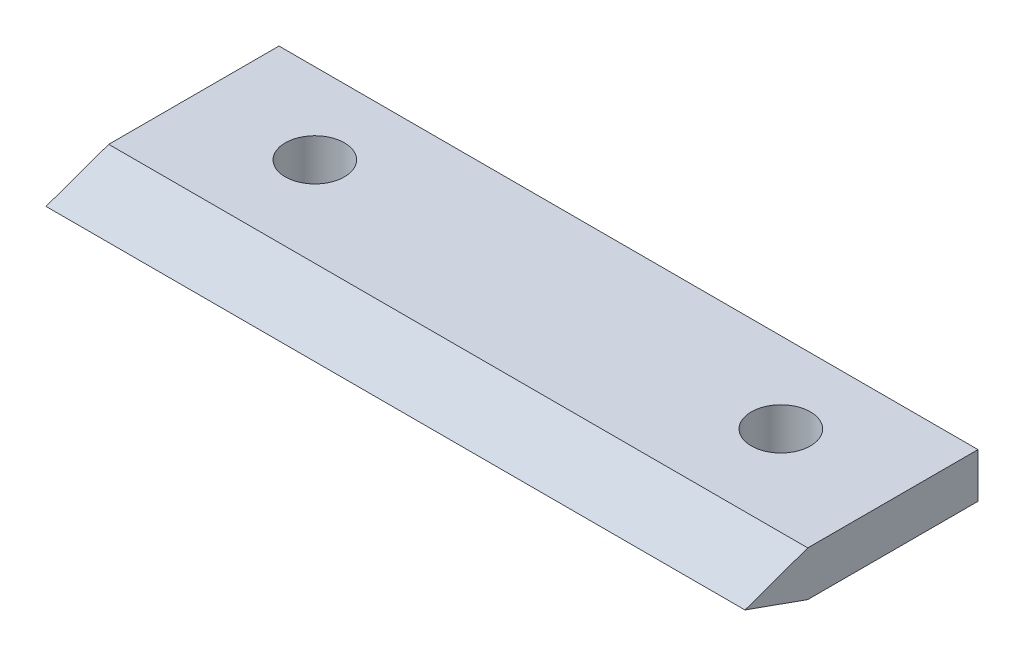
ISO-10303-21;
HEADER;
FILE_DESCRIPTION(('STEP AP214'),'2;1');
FILE_NAME('part.step','',(''),(''),'','','');
FILE_SCHEMA(('AUTOMOTIVE_DESIGN { 1 0 10303 214 1 1 1 1 }'));
ENDSEC;
DATA;
#1=APPLICATION_CONTEXT('core data for automotive mechanical design processes');
#2=APPLICATION_PROTOCOL_DEFINITION('international standard','automotive_design',2000,#1);
#3=PRODUCT_CONTEXT('',#1,'mechanical');
#4=PRODUCT('Part','Part','',(#3));
#5=PRODUCT_RELATED_PRODUCT_CATEGORY('part','',(#4));
#6=PRODUCT_DEFINITION_FORMATION('','',#4);
#7=PRODUCT_DEFINITION_CONTEXT('part definition',#1,'design');
#8=PRODUCT_DEFINITION('design','',#6,#7);
#9=PRODUCT_DEFINITION_SHAPE('','',#8);
#10=(LENGTH_UNIT() NAMED_UNIT(*) SI_UNIT(.MILLI.,.METRE.));
#11=(NAMED_UNIT(*) PLANE_ANGLE_UNIT() SI_UNIT($,.RADIAN.));
#12=(NAMED_UNIT(*) SI_UNIT($,.STERADIAN.) SOLID_ANGLE_UNIT());
#13=UNCERTAINTY_MEASURE_WITH_UNIT(LENGTH_MEASURE(1.E-05),#10,'distance_accuracy_value','');
#14=(GEOMETRIC_REPRESENTATION_CONTEXT(3) GLOBAL_UNCERTAINTY_ASSIGNED_CONTEXT((#13)) GLOBAL_UNIT_ASSIGNED_CONTEXT((#10,
#11,#12)) REPRESENTATION_CONTEXT('',''));
#15=CARTESIAN_POINT('',(0.,0.,0.));
#16=DIRECTION('',(0.,0.,1.));
#17=DIRECTION('',(1.,0.,0.));
#18=AXIS2_PLACEMENT_3D('',#15,#16,#17);
#19=CARTESIAN_POINT('',(0.,2.5,0.));
#20=DIRECTION('',(0.,-1.,0.));
#21=DIRECTION('',(0.,0.,-1.));
#22=AXIS2_PLACEMENT_3D('',#19,#20,#21);
#23=PLANE('',#22);
#24=DIRECTION('',(0.,0.,1.));
#25=VECTOR('',#24,1.);
#26=CARTESIAN_POINT('',(0.,2.5,0.));
#27=LINE('',#26,#25);
#28=CARTESIAN_POINT('',(0.,2.5,-13.));
#29=VERTEX_POINT('',#28);
#30=CARTESIAN_POINT('',(0.,2.5,-3.5));
#31=VERTEX_POINT('',#30);
#32=EDGE_CURVE('E92',#29,#31,#27,.T.);
#33=ORIENTED_EDGE('',*,*,#32,.T.);
#34=DIRECTION('',(1.,0.,0.));
#35=VECTOR('',#34,1.);
#36=CARTESIAN_POINT('',(-3.,2.5,-3.5));
#37=LINE('',#36,#35);
#38=CARTESIAN_POINT('',(39.,2.5,-3.5));
#39=VERTEX_POINT('',#38);
#40=EDGE_CURVE('E139',#31,#39,#37,.T.);
#41=ORIENTED_EDGE('',*,*,#40,.T.);
#42=DIRECTION('',(0.,0.,-1.));
#43=VECTOR('',#42,1.);
#44=CARTESIAN_POINT('',(39.,2.5,0.));
#45=LINE('',#44,#43);
#46=CARTESIAN_POINT('',(39.,2.5,-13.));
#47=VERTEX_POINT('',#46);
#48=EDGE_CURVE('E119',#39,#47,#45,.T.);
#49=ORIENTED_EDGE('',*,*,#48,.T.);
#50=DIRECTION('',(-1.,0.,0.));
#51=VECTOR('',#50,1.);
#52=CARTESIAN_POINT('',(0.,2.5,-13.));
#53=LINE('',#52,#51);
#54=EDGE_CURVE('E71',#47,#29,#53,.T.);
#55=ORIENTED_EDGE('',*,*,#54,.T.);
#56=EDGE_LOOP('',(#33,#41,#49,#55));
#57=FACE_BOUND('',#56,.T.);
#58=CARTESIAN_POINT('',(6.5,2.5,-8.5));
#59=DIRECTION('',(0.,1.,0.));
#60=DIRECTION('',(0.,0.,1.));
#61=AXIS2_PLACEMENT_3D('',#58,#59,#60);
#62=CIRCLE('',#61,1.65);
#63=CARTESIAN_POINT('',(6.5,2.5,-6.85));
#64=VERTEX_POINT('',#63);
#65=EDGE_CURVE('E107',#64,#64,#62,.T.);
#66=ORIENTED_EDGE('',*,*,#65,.F.);
#67=EDGE_LOOP('',(#66));
#68=FACE_BOUND('',#67,.T.);
#69=CARTESIAN_POINT('',(32.5,2.5,-8.5));
#70=DIRECTION('',(0.,1.,0.));
#71=DIRECTION('',(0.,0.,1.));
#72=AXIS2_PLACEMENT_3D('',#69,#70,#71);
#73=CIRCLE('',#72,1.65);
#74=CARTESIAN_POINT('',(32.5,2.5,-6.85));
#75=VERTEX_POINT('',#74);
#76=EDGE_CURVE('E126',#75,#75,#73,.T.);
#77=ORIENTED_EDGE('',*,*,#76,.F.);
#78=EDGE_LOOP('',(#77));
#79=FACE_BOUND('',#78,.T.);
#80=ADVANCED_FACE('F46',(#57,#68,#79),#23,.F.);
#81=CARTESIAN_POINT('',(0.,0.,0.));
#82=DIRECTION('',(0.,-1.,0.));
#83=DIRECTION('',(0.,0.,-1.));
#84=AXIS2_PLACEMENT_3D('',#81,#82,#83);
#85=PLANE('',#84);
#86=DIRECTION('',(1.,0.,0.));
#87=VECTOR('',#86,1.);
#88=CARTESIAN_POINT('',(-3.,0.,-3.5));
#89=LINE('',#88,#87);
#90=CARTESIAN_POINT('',(0.,0.,-3.5));
#91=VERTEX_POINT('',#90);
#92=CARTESIAN_POINT('',(39.,0.,-3.5));
#93=VERTEX_POINT('',#92);
#94=EDGE_CURVE('E105',#91,#93,#89,.T.);
#95=ORIENTED_EDGE('',*,*,#94,.F.);
#96=DIRECTION('',(0.,0.,1.));
#97=VECTOR('',#96,1.);
#98=CARTESIAN_POINT('',(0.,0.,0.));
#99=LINE('',#98,#97);
#100=CARTESIAN_POINT('',(0.,0.,-13.));
#101=VERTEX_POINT('',#100);
#102=EDGE_CURVE('E99',#101,#91,#99,.T.);
#103=ORIENTED_EDGE('',*,*,#102,.F.);
#104=DIRECTION('',(-1.,0.,0.));
#105=VECTOR('',#104,1.);
#106=CARTESIAN_POINT('',(0.,0.,-13.));
#107=LINE('',#106,#105);
#108=CARTESIAN_POINT('',(39.,0.,-13.));
#109=VERTEX_POINT('',#108);
#110=EDGE_CURVE('E83',#109,#101,#107,.T.);
#111=ORIENTED_EDGE('',*,*,#110,.F.);
#112=DIRECTION('',(0.,0.,-1.));
#113=VECTOR('',#112,1.);
#114=CARTESIAN_POINT('',(39.,0.,0.));
#115=LINE('',#114,#113);
#116=EDGE_CURVE('E93',#93,#109,#115,.T.);
#117=ORIENTED_EDGE('',*,*,#116,.F.);
#118=EDGE_LOOP('',(#95,#103,#111,#117));
#119=FACE_BOUND('',#118,.T.);
#120=CARTESIAN_POINT('',(6.5,0.,-8.5));
#121=DIRECTION('',(0.,1.,0.));
#122=DIRECTION('',(0.,0.,1.));
#123=AXIS2_PLACEMENT_3D('',#120,#121,#122);
#124=CIRCLE('',#123,1.65);
#125=CARTESIAN_POINT('',(6.5,0.,-6.85));
#126=VERTEX_POINT('',#125);
#127=EDGE_CURVE('E114',#126,#126,#124,.T.);
#128=ORIENTED_EDGE('',*,*,#127,.T.);
#129=EDGE_LOOP('',(#128));
#130=FACE_BOUND('',#129,.T.);
#131=CARTESIAN_POINT('',(32.5,0.,-8.5));
#132=DIRECTION('',(0.,1.,0.));
#133=DIRECTION('',(0.,0.,1.));
#134=AXIS2_PLACEMENT_3D('',#131,#132,#133);
#135=CIRCLE('',#134,1.65);
#136=CARTESIAN_POINT('',(32.5,0.,-6.85));
#137=VERTEX_POINT('',#136);
#138=EDGE_CURVE('E128',#137,#137,#135,.T.);
#139=ORIENTED_EDGE('',*,*,#138,.T.);
#140=EDGE_LOOP('',(#139));
#141=FACE_BOUND('',#140,.T.);
#142=ADVANCED_FACE('F103',(#119,#130,#141),#85,.T.);
#143=CARTESIAN_POINT('',(0.,2.5,0.));
#144=DIRECTION('',(1.,0.,0.));
#145=DIRECTION('',(0.,0.,-1.));
#146=AXIS2_PLACEMENT_3D('',#143,#144,#145);
#147=PLANE('',#146);
#148=ORIENTED_EDGE('',*,*,#102,.T.);
#149=DIRECTION('',(0.,0.336336396998156,0.941741911594838));
#150=VECTOR('',#149,1.);
#151=CARTESIAN_POINT('',(0.,1.39140271493213,0.395927601809955));
#152=LINE('',#151,#150);
#153=CARTESIAN_POINT('',(0.,1.25,0.));
#154=VERTEX_POINT('',#153);
#155=EDGE_CURVE('E149',#91,#154,#152,.T.);
#156=ORIENTED_EDGE('',*,*,#155,.T.);
#157=DIRECTION('',(0.,0.336336396998156,-0.941741911594838));
#158=VECTOR('',#157,1.);
#159=CARTESIAN_POINT('',(0.,1.39140271493213,-0.395927601809955));
#160=LINE('',#159,#158);
#161=EDGE_CURVE('E132',#154,#31,#160,.T.);
#162=ORIENTED_EDGE('',*,*,#161,.T.);
#163=ORIENTED_EDGE('',*,*,#32,.F.);
#164=DIRECTION('',(0.,-1.,0.));
#165=VECTOR('',#164,1.);
#166=CARTESIAN_POINT('',(0.,2.5,-13.));
#167=LINE('',#166,#165);
#168=EDGE_CURVE('E55',#29,#101,#167,.T.);
#169=ORIENTED_EDGE('',*,*,#168,.T.);
#170=EDGE_LOOP('',(#148,#156,#162,#163,#169));
#171=FACE_BOUND('',#170,.T.);
#172=ADVANCED_FACE('F48',(#171),#147,.F.);
#173=CARTESIAN_POINT('',(39.,2.5,0.));
#174=DIRECTION('',(-1.,0.,0.));
#175=DIRECTION('',(0.,0.,1.));
#176=AXIS2_PLACEMENT_3D('',#173,#174,#175);
#177=PLANE('',#176);
#178=DIRECTION('',(0.,0.336336396998156,-0.941741911594837));
#179=VECTOR('',#178,1.);
#180=CARTESIAN_POINT('',(39.,1.25,0.));
#181=LINE('',#180,#179);
#182=CARTESIAN_POINT('',(39.,1.25,0.));
#183=VERTEX_POINT('',#182);
#184=EDGE_CURVE('E143',#183,#39,#181,.T.);
#185=ORIENTED_EDGE('',*,*,#184,.F.);
#186=DIRECTION('',(0.,0.336336396998156,0.941741911594837));
#187=VECTOR('',#186,1.);
#188=CARTESIAN_POINT('',(39.,0.,-3.5));
#189=LINE('',#188,#187);
#190=EDGE_CURVE('E62',#93,#183,#189,.T.);
#191=ORIENTED_EDGE('',*,*,#190,.F.);
#192=ORIENTED_EDGE('',*,*,#116,.T.);
#193=DIRECTION('',(0.,-1.,0.));
#194=VECTOR('',#193,1.);
#195=CARTESIAN_POINT('',(39.,2.5,-13.));
#196=LINE('',#195,#194);
#197=EDGE_CURVE('E11',#47,#109,#196,.T.);
#198=ORIENTED_EDGE('',*,*,#197,.F.);
#199=ORIENTED_EDGE('',*,*,#48,.F.);
#200=EDGE_LOOP('',(#185,#191,#192,#198,#199));
#201=FACE_BOUND('',#200,.T.);
#202=ADVANCED_FACE('F180',(#201),#177,.F.);
#203=CARTESIAN_POINT('',(0.,2.5,-13.));
#204=DIRECTION('',(0.,0.,1.));
#205=DIRECTION('',(1.,0.,0.));
#206=AXIS2_PLACEMENT_3D('',#203,#204,#205);
#207=PLANE('',#206);
#208=ORIENTED_EDGE('',*,*,#110,.T.);
#209=ORIENTED_EDGE('',*,*,#168,.F.);
#210=ORIENTED_EDGE('',*,*,#54,.F.);
#211=ORIENTED_EDGE('',*,*,#197,.T.);
#212=EDGE_LOOP('',(#208,#209,#210,#211));
#213=FACE_BOUND('',#212,.T.);
#214=ADVANCED_FACE('F85',(#213),#207,.F.);
#215=CARTESIAN_POINT('',(6.5,2.5,-8.5));
#216=DIRECTION('',(0.,-1.,0.));
#217=DIRECTION('',(0.,0.,-1.));
#218=AXIS2_PLACEMENT_3D('',#215,#216,#217);
#219=CYLINDRICAL_SURFACE('',#218,1.65);
#220=ORIENTED_EDGE('',*,*,#65,.T.);
#221=EDGE_LOOP('',(#220));
#222=FACE_BOUND('',#221,.T.);
#223=ORIENTED_EDGE('',*,*,#127,.F.);
#224=EDGE_LOOP('',(#223));
#225=FACE_BOUND('',#224,.T.);
#226=ADVANCED_FACE('F200',(#222,#225),#219,.F.);
#227=CARTESIAN_POINT('',(32.5,2.5,-8.5));
#228=DIRECTION('',(0.,-1.,0.));
#229=DIRECTION('',(0.,0.,-1.));
#230=AXIS2_PLACEMENT_3D('',#227,#228,#229);
#231=CYLINDRICAL_SURFACE('',#230,1.65);
#232=ORIENTED_EDGE('',*,*,#76,.T.);
#233=EDGE_LOOP('',(#232));
#234=FACE_BOUND('',#233,.T.);
#235=ORIENTED_EDGE('',*,*,#138,.F.);
#236=EDGE_LOOP('',(#235));
#237=FACE_BOUND('',#236,.T.);
#238=ADVANCED_FACE('F197',(#234,#237),#231,.F.);
#239=CARTESIAN_POINT('',(-3.,1.25,0.));
#240=DIRECTION('',(0.,-0.941741911594837,-0.336336396998156));
#241=DIRECTION('',(0.,0.336336396998156,-0.941741911594838));
#242=AXIS2_PLACEMENT_3D('',#239,#240,#241);
#243=PLANE('',#242);
#244=DIRECTION('',(1.,0.,0.));
#245=VECTOR('',#244,1.);
#246=CARTESIAN_POINT('',(-3.,1.25,0.));
#247=LINE('',#246,#245);
#248=EDGE_CURVE('E138',#154,#183,#247,.T.);
#249=ORIENTED_EDGE('',*,*,#248,.T.);
#250=ORIENTED_EDGE('',*,*,#184,.T.);
#251=ORIENTED_EDGE('',*,*,#40,.F.);
#252=ORIENTED_EDGE('',*,*,#161,.F.);
#253=EDGE_LOOP('',(#249,#250,#251,#252));
#254=FACE_BOUND('',#253,.T.);
#255=ADVANCED_FACE('F185',(#254),#243,.F.);
#256=CARTESIAN_POINT('',(-3.,0.,-3.5));
#257=DIRECTION('',(0.,0.941741911594837,-0.336336396998156));
#258=DIRECTION('',(0.,0.336336396998156,0.941741911594838));
#259=AXIS2_PLACEMENT_3D('',#256,#257,#258);
#260=PLANE('',#259);
#261=ORIENTED_EDGE('',*,*,#94,.T.);
#262=ORIENTED_EDGE('',*,*,#190,.T.);
#263=ORIENTED_EDGE('',*,*,#248,.F.);
#264=ORIENTED_EDGE('',*,*,#155,.F.);
#265=EDGE_LOOP('',(#261,#262,#263,#264));
#266=FACE_BOUND('',#265,.T.);
#267=ADVANCED_FACE('F175',(#266),#260,.F.);
#268=CLOSED_SHELL('',(#80,#142,#172,#202,#214,#226,#238,#255,#267));
#269=MANIFOLD_SOLID_BREP('B2',#268);
#270=ADVANCED_BREP_SHAPE_REPRESENTATION('',(#18,#269),#14);
#271=SHAPE_DEFINITION_REPRESENTATION(#9,#270);
ENDSEC;
END-ISO-10303-21;
